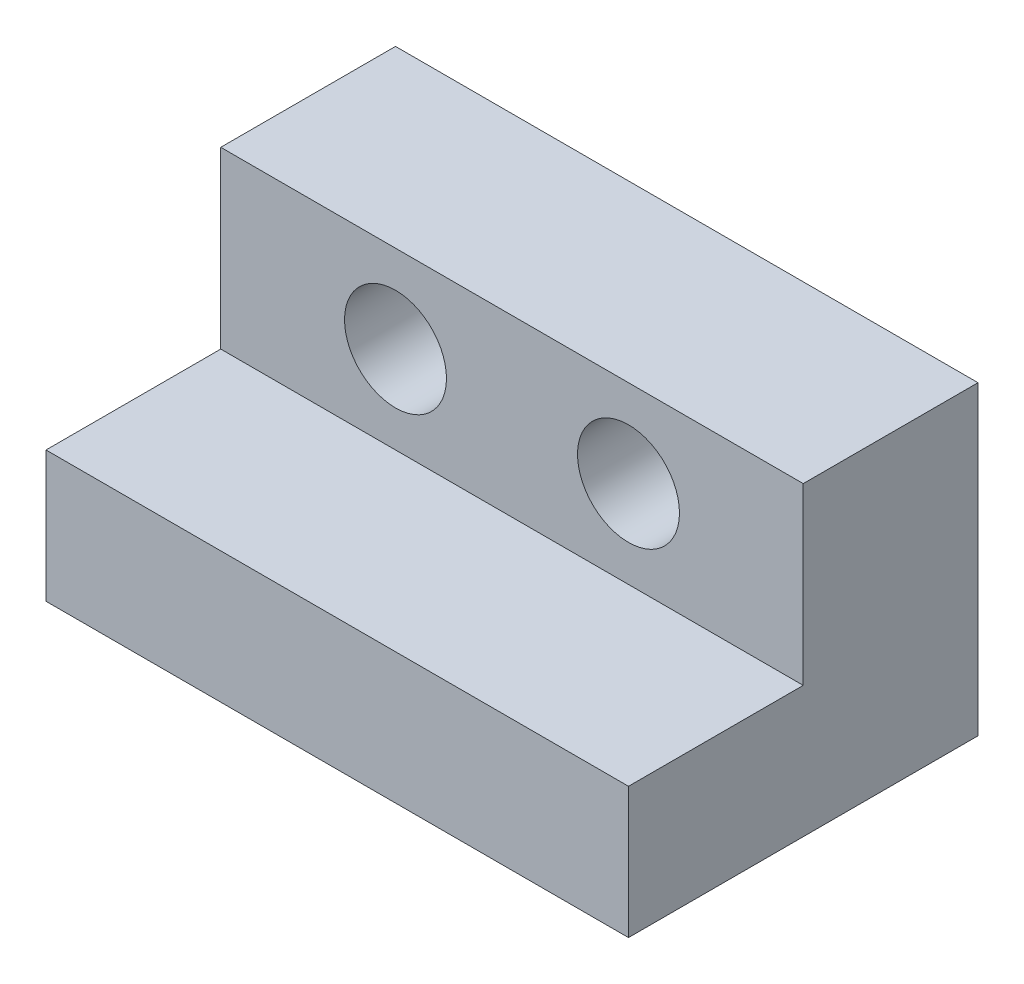
ISO-10303-21;
HEADER;
FILE_DESCRIPTION(('STEP AP214'),'2;1');
FILE_NAME('part.step','',(''),(''),'','','');
FILE_SCHEMA(('AUTOMOTIVE_DESIGN { 1 0 10303 214 1 1 1 1 }'));
ENDSEC;
DATA;
#1=APPLICATION_CONTEXT('core data for automotive mechanical design processes');
#2=APPLICATION_PROTOCOL_DEFINITION('international standard','automotive_design',2000,#1);
#3=PRODUCT_CONTEXT('',#1,'mechanical');
#4=PRODUCT('Part','Part','',(#3));
#5=PRODUCT_RELATED_PRODUCT_CATEGORY('part','',(#4));
#6=PRODUCT_DEFINITION_FORMATION('','',#4);
#7=PRODUCT_DEFINITION_CONTEXT('part definition',#1,'design');
#8=PRODUCT_DEFINITION('design','',#6,#7);
#9=PRODUCT_DEFINITION_SHAPE('','',#8);
#10=(LENGTH_UNIT() NAMED_UNIT(*) SI_UNIT(.MILLI.,.METRE.));
#11=(NAMED_UNIT(*) PLANE_ANGLE_UNIT() SI_UNIT($,.RADIAN.));
#12=(NAMED_UNIT(*) SI_UNIT($,.STERADIAN.) SOLID_ANGLE_UNIT());
#13=UNCERTAINTY_MEASURE_WITH_UNIT(LENGTH_MEASURE(1.E-05),#10,'distance_accuracy_value','');
#14=(GEOMETRIC_REPRESENTATION_CONTEXT(3) GLOBAL_UNCERTAINTY_ASSIGNED_CONTEXT((#13)) GLOBAL_UNIT_ASSIGNED_CONTEXT((#10,
#11,#12)) REPRESENTATION_CONTEXT('',''));
#15=CARTESIAN_POINT('',(0.,0.,0.));
#16=DIRECTION('',(0.,0.,1.));
#17=DIRECTION('',(1.,0.,0.));
#18=AXIS2_PLACEMENT_3D('',#15,#16,#17);
#19=CARTESIAN_POINT('',(-10.,15.5,12.));
#20=DIRECTION('',(0.,-1.,0.));
#21=DIRECTION('',(0.,0.,-1.));
#22=AXIS2_PLACEMENT_3D('',#19,#20,#21);
#23=PLANE('',#22);
#24=DIRECTION('',(-1.,0.,0.));
#25=VECTOR('',#24,1.);
#26=CARTESIAN_POINT('',(0.,15.5,6.));
#27=LINE('',#26,#25);
#28=CARTESIAN_POINT('',(10.,15.5,6.));
#29=VERTEX_POINT('',#28);
#30=CARTESIAN_POINT('',(-10.,15.5,6.));
#31=VERTEX_POINT('',#30);
#32=EDGE_CURVE('E54',#29,#31,#27,.T.);
#33=ORIENTED_EDGE('',*,*,#32,.F.);
#34=DIRECTION('',(0.,0.,-1.));
#35=VECTOR('',#34,1.);
#36=CARTESIAN_POINT('',(10.,15.5,12.));
#37=LINE('',#36,#35);
#38=CARTESIAN_POINT('',(10.,15.5,0.));
#39=VERTEX_POINT('',#38);
#40=EDGE_CURVE('E11',#29,#39,#37,.T.);
#41=ORIENTED_EDGE('',*,*,#40,.T.);
#42=DIRECTION('',(-1.,0.,0.));
#43=VECTOR('',#42,1.);
#44=CARTESIAN_POINT('',(-10.,15.5,0.));
#45=LINE('',#44,#43);
#46=CARTESIAN_POINT('',(-10.,15.5,0.));
#47=VERTEX_POINT('',#46);
#48=EDGE_CURVE('E105',#39,#47,#45,.T.);
#49=ORIENTED_EDGE('',*,*,#48,.T.);
#50=DIRECTION('',(0.,0.,-1.));
#51=VECTOR('',#50,1.);
#52=CARTESIAN_POINT('',(-10.,15.5,12.));
#53=LINE('',#52,#51);
#54=EDGE_CURVE('E47',#31,#47,#53,.T.);
#55=ORIENTED_EDGE('',*,*,#54,.F.);
#56=EDGE_LOOP('',(#33,#41,#49,#55));
#57=FACE_BOUND('',#56,.T.);
#58=ADVANCED_FACE('F39',(#57),#23,.F.);
#59=CARTESIAN_POINT('',(4.,12.5,12.));
#60=DIRECTION('',(0.,0.,-1.));
#61=DIRECTION('',(-1.,0.,0.));
#62=AXIS2_PLACEMENT_3D('',#59,#60,#61);
#63=CYLINDRICAL_SURFACE('',#62,1.75);
#64=CARTESIAN_POINT('',(4.,12.5,0.));
#65=DIRECTION('',(0.,0.,1.));
#66=DIRECTION('',(1.,0.,0.));
#67=AXIS2_PLACEMENT_3D('',#64,#65,#66);
#68=CIRCLE('',#67,1.75);
#69=CARTESIAN_POINT('',(5.75,12.5,0.));
#70=VERTEX_POINT('',#69);
#71=EDGE_CURVE('E106',#70,#70,#68,.T.);
#72=ORIENTED_EDGE('',*,*,#71,.F.);
#73=EDGE_LOOP('',(#72));
#74=FACE_BOUND('',#73,.T.);
#75=CARTESIAN_POINT('',(4.,12.5,6.));
#76=DIRECTION('',(0.,0.,1.));
#77=DIRECTION('',(1.,0.,0.));
#78=AXIS2_PLACEMENT_3D('',#75,#76,#77);
#79=CIRCLE('',#78,1.75);
#80=CARTESIAN_POINT('',(5.75,12.5,6.));
#81=VERTEX_POINT('',#80);
#82=EDGE_CURVE('E157',#81,#81,#79,.F.);
#83=ORIENTED_EDGE('',*,*,#82,.F.);
#84=EDGE_LOOP('',(#83));
#85=FACE_BOUND('',#84,.T.);
#86=ADVANCED_FACE('F183',(#74,#85),#63,.F.);
#87=CARTESIAN_POINT('',(-4.,12.5,12.));
#88=DIRECTION('',(0.,0.,-1.));
#89=DIRECTION('',(-1.,0.,0.));
#90=AXIS2_PLACEMENT_3D('',#87,#88,#89);
#91=CYLINDRICAL_SURFACE('',#90,1.75);
#92=CARTESIAN_POINT('',(-4.,12.5,0.));
#93=DIRECTION('',(0.,0.,1.));
#94=DIRECTION('',(-1.,0.,0.));
#95=AXIS2_PLACEMENT_3D('',#92,#93,#94);
#96=CIRCLE('',#95,1.75);
#97=CARTESIAN_POINT('',(-5.75,12.5,0.));
#98=VERTEX_POINT('',#97);
#99=EDGE_CURVE('E110',#98,#98,#96,.T.);
#100=ORIENTED_EDGE('',*,*,#99,.F.);
#101=EDGE_LOOP('',(#100));
#102=FACE_BOUND('',#101,.T.);
#103=CARTESIAN_POINT('',(-4.,12.5,6.));
#104=DIRECTION('',(0.,0.,1.));
#105=DIRECTION('',(1.,0.,0.));
#106=AXIS2_PLACEMENT_3D('',#103,#104,#105);
#107=CIRCLE('',#106,1.75);
#108=CARTESIAN_POINT('',(-2.25,12.5,6.));
#109=VERTEX_POINT('',#108);
#110=EDGE_CURVE('E146',#109,#109,#107,.F.);
#111=ORIENTED_EDGE('',*,*,#110,.F.);
#112=EDGE_LOOP('',(#111));
#113=FACE_BOUND('',#112,.T.);
#114=ADVANCED_FACE('F187',(#102,#113),#91,.F.);
#115=CARTESIAN_POINT('',(0.,0.,12.));
#116=DIRECTION('',(0.,0.,-1.));
#117=DIRECTION('',(-1.,0.,0.));
#118=AXIS2_PLACEMENT_3D('',#115,#116,#117);
#119=PLANE('',#118);
#120=DIRECTION('',(0.,1.,0.));
#121=VECTOR('',#120,1.);
#122=CARTESIAN_POINT('',(10.,5.,12.));
#123=LINE('',#122,#121);
#124=CARTESIAN_POINT('',(10.,5.,12.));
#125=VERTEX_POINT('',#124);
#126=CARTESIAN_POINT('',(10.,9.5,12.));
#127=VERTEX_POINT('',#126);
#128=EDGE_CURVE('E91',#125,#127,#123,.T.);
#129=ORIENTED_EDGE('',*,*,#128,.T.);
#130=DIRECTION('',(1.,0.,0.));
#131=VECTOR('',#130,1.);
#132=CARTESIAN_POINT('',(0.,9.5,12.));
#133=LINE('',#132,#131);
#134=CARTESIAN_POINT('',(-10.,9.5,12.));
#135=VERTEX_POINT('',#134);
#136=EDGE_CURVE('E138',#135,#127,#133,.T.);
#137=ORIENTED_EDGE('',*,*,#136,.F.);
#138=DIRECTION('',(0.,-1.,0.));
#139=VECTOR('',#138,1.);
#140=CARTESIAN_POINT('',(-10.,5.,12.));
#141=LINE('',#140,#139);
#142=CARTESIAN_POINT('',(-10.,5.,12.));
#143=VERTEX_POINT('',#142);
#144=EDGE_CURVE('E148',#135,#143,#141,.T.);
#145=ORIENTED_EDGE('',*,*,#144,.T.);
#146=DIRECTION('',(1.,0.,0.));
#147=VECTOR('',#146,1.);
#148=CARTESIAN_POINT('',(-10.,5.,12.));
#149=LINE('',#148,#147);
#150=EDGE_CURVE('E63',#143,#125,#149,.T.);
#151=ORIENTED_EDGE('',*,*,#150,.T.);
#152=EDGE_LOOP('',(#129,#137,#145,#151));
#153=FACE_BOUND('',#152,.T.);
#154=ADVANCED_FACE('F156',(#153),#119,.F.);
#155=CARTESIAN_POINT('',(0.,0.,0.));
#156=DIRECTION('',(0.,0.,-1.));
#157=DIRECTION('',(-1.,0.,0.));
#158=AXIS2_PLACEMENT_3D('',#155,#156,#157);
#159=PLANE('',#158);
#160=ORIENTED_EDGE('',*,*,#71,.T.);
#161=EDGE_LOOP('',(#160));
#162=FACE_BOUND('',#161,.T.);
#163=DIRECTION('',(0.,1.,0.));
#164=VECTOR('',#163,1.);
#165=CARTESIAN_POINT('',(10.,5.,0.));
#166=LINE('',#165,#164);
#167=CARTESIAN_POINT('',(10.,5.,0.));
#168=VERTEX_POINT('',#167);
#169=EDGE_CURVE('E98',#168,#39,#166,.T.);
#170=ORIENTED_EDGE('',*,*,#169,.F.);
#171=DIRECTION('',(1.,0.,0.));
#172=VECTOR('',#171,1.);
#173=CARTESIAN_POINT('',(-10.,5.,0.));
#174=LINE('',#173,#172);
#175=CARTESIAN_POINT('',(-10.,5.,0.));
#176=VERTEX_POINT('',#175);
#177=EDGE_CURVE('E81',#176,#168,#174,.T.);
#178=ORIENTED_EDGE('',*,*,#177,.F.);
#179=DIRECTION('',(0.,-1.,0.));
#180=VECTOR('',#179,1.);
#181=CARTESIAN_POINT('',(-10.,5.,0.));
#182=LINE('',#181,#180);
#183=EDGE_CURVE('E92',#47,#176,#182,.T.);
#184=ORIENTED_EDGE('',*,*,#183,.F.);
#185=ORIENTED_EDGE('',*,*,#48,.F.);
#186=EDGE_LOOP('',(#170,#178,#184,#185));
#187=FACE_BOUND('',#186,.T.);
#188=ORIENTED_EDGE('',*,*,#99,.T.);
#189=EDGE_LOOP('',(#188));
#190=FACE_BOUND('',#189,.T.);
#191=ADVANCED_FACE('F102',(#162,#187,#190),#159,.T.);
#192=CARTESIAN_POINT('',(10.,5.,12.));
#193=DIRECTION('',(-1.,0.,0.));
#194=DIRECTION('',(0.,0.,1.));
#195=AXIS2_PLACEMENT_3D('',#192,#193,#194);
#196=PLANE('',#195);
#197=DIRECTION('',(0.,1.,0.));
#198=VECTOR('',#197,1.);
#199=CARTESIAN_POINT('',(10.,0.,6.));
#200=LINE('',#199,#198);
#201=CARTESIAN_POINT('',(10.,9.5,6.));
#202=VERTEX_POINT('',#201);
#203=EDGE_CURVE('E124',#202,#29,#200,.T.);
#204=ORIENTED_EDGE('',*,*,#203,.F.);
#205=DIRECTION('',(0.,0.,1.));
#206=VECTOR('',#205,1.);
#207=CARTESIAN_POINT('',(10.,9.5,6.));
#208=LINE('',#207,#206);
#209=EDGE_CURVE('E143',#202,#127,#208,.T.);
#210=ORIENTED_EDGE('',*,*,#209,.T.);
#211=ORIENTED_EDGE('',*,*,#128,.F.);
#212=DIRECTION('',(0.,0.,-1.));
#213=VECTOR('',#212,1.);
#214=CARTESIAN_POINT('',(10.,5.,12.));
#215=LINE('',#214,#213);
#216=EDGE_CURVE('E84',#125,#168,#215,.T.);
#217=ORIENTED_EDGE('',*,*,#216,.T.);
#218=ORIENTED_EDGE('',*,*,#169,.T.);
#219=ORIENTED_EDGE('',*,*,#40,.F.);
#220=EDGE_LOOP('',(#204,#210,#211,#217,#218,#219));
#221=FACE_BOUND('',#220,.T.);
#222=ADVANCED_FACE('F41',(#221),#196,.F.);
#223=CARTESIAN_POINT('',(-10.,5.,12.));
#224=DIRECTION('',(1.,0.,0.));
#225=DIRECTION('',(0.,0.,-1.));
#226=AXIS2_PLACEMENT_3D('',#223,#224,#225);
#227=PLANE('',#226);
#228=ORIENTED_EDGE('',*,*,#144,.F.);
#229=DIRECTION('',(0.,0.,1.));
#230=VECTOR('',#229,1.);
#231=CARTESIAN_POINT('',(-10.,9.5,6.));
#232=LINE('',#231,#230);
#233=CARTESIAN_POINT('',(-10.,9.5,6.));
#234=VERTEX_POINT('',#233);
#235=EDGE_CURVE('E142',#234,#135,#232,.T.);
#236=ORIENTED_EDGE('',*,*,#235,.F.);
#237=DIRECTION('',(0.,-1.,0.));
#238=VECTOR('',#237,1.);
#239=CARTESIAN_POINT('',(-10.,0.,6.));
#240=LINE('',#239,#238);
#241=EDGE_CURVE('E121',#31,#234,#240,.T.);
#242=ORIENTED_EDGE('',*,*,#241,.F.);
#243=ORIENTED_EDGE('',*,*,#54,.T.);
#244=ORIENTED_EDGE('',*,*,#183,.T.);
#245=DIRECTION('',(0.,0.,-1.));
#246=VECTOR('',#245,1.);
#247=CARTESIAN_POINT('',(-10.,5.,12.));
#248=LINE('',#247,#246);
#249=EDGE_CURVE('E87',#143,#176,#248,.T.);
#250=ORIENTED_EDGE('',*,*,#249,.F.);
#251=EDGE_LOOP('',(#228,#236,#242,#243,#244,#250));
#252=FACE_BOUND('',#251,.T.);
#253=ADVANCED_FACE('F119',(#252),#227,.F.);
#254=CARTESIAN_POINT('',(-10.,5.,12.));
#255=DIRECTION('',(0.,1.,0.));
#256=DIRECTION('',(0.,0.,1.));
#257=AXIS2_PLACEMENT_3D('',#254,#255,#256);
#258=PLANE('',#257);
#259=CARTESIAN_POINT('',(0.,5.,5.));
#260=DIRECTION('',(0.,-1.,0.));
#261=DIRECTION('',(0.,0.,-1.));
#262=AXIS2_PLACEMENT_3D('',#259,#260,#261);
#263=CIRCLE('',#262,4.25);
#264=CARTESIAN_POINT('',(0.,5.,0.75));
#265=VERTEX_POINT('',#264);
#266=EDGE_CURVE('E162',#265,#265,#263,.T.);
#267=ORIENTED_EDGE('',*,*,#266,.F.);
#268=EDGE_LOOP('',(#267));
#269=FACE_BOUND('',#268,.T.);
#270=ORIENTED_EDGE('',*,*,#177,.T.);
#271=ORIENTED_EDGE('',*,*,#216,.F.);
#272=ORIENTED_EDGE('',*,*,#150,.F.);
#273=ORIENTED_EDGE('',*,*,#249,.T.);
#274=EDGE_LOOP('',(#270,#271,#272,#273));
#275=FACE_BOUND('',#274,.T.);
#276=ADVANCED_FACE('F83',(#269,#275),#258,.F.);
#277=CARTESIAN_POINT('',(0.,9.5,6.));
#278=DIRECTION('',(0.,-1.,0.));
#279=DIRECTION('',(0.,0.,-1.));
#280=AXIS2_PLACEMENT_3D('',#277,#278,#279);
#281=PLANE('',#280);
#282=ORIENTED_EDGE('',*,*,#136,.T.);
#283=ORIENTED_EDGE('',*,*,#209,.F.);
#284=DIRECTION('',(1.,0.,0.));
#285=VECTOR('',#284,1.);
#286=CARTESIAN_POINT('',(0.,9.5,6.));
#287=LINE('',#286,#285);
#288=EDGE_CURVE('E140',#234,#202,#287,.T.);
#289=ORIENTED_EDGE('',*,*,#288,.F.);
#290=ORIENTED_EDGE('',*,*,#235,.T.);
#291=EDGE_LOOP('',(#282,#283,#289,#290));
#292=FACE_BOUND('',#291,.T.);
#293=ADVANCED_FACE('F141',(#292),#281,.F.);
#294=CARTESIAN_POINT('',(0.,0.,6.));
#295=DIRECTION('',(0.,0.,1.));
#296=DIRECTION('',(1.,0.,0.));
#297=AXIS2_PLACEMENT_3D('',#294,#295,#296);
#298=PLANE('',#297);
#299=ORIENTED_EDGE('',*,*,#82,.T.);
#300=EDGE_LOOP('',(#299));
#301=FACE_BOUND('',#300,.T.);
#302=ORIENTED_EDGE('',*,*,#110,.T.);
#303=EDGE_LOOP('',(#302));
#304=FACE_BOUND('',#303,.T.);
#305=ORIENTED_EDGE('',*,*,#241,.T.);
#306=ORIENTED_EDGE('',*,*,#288,.T.);
#307=ORIENTED_EDGE('',*,*,#203,.T.);
#308=ORIENTED_EDGE('',*,*,#32,.T.);
#309=EDGE_LOOP('',(#305,#306,#307,#308));
#310=FACE_BOUND('',#309,.T.);
#311=ADVANCED_FACE('F145',(#301,#304,#310),#298,.T.);
#312=CARTESIAN_POINT('',(0.,8.,5.));
#313=DIRECTION('',(0.,-1.,0.));
#314=DIRECTION('',(0.,0.,-1.));
#315=AXIS2_PLACEMENT_3D('',#312,#313,#314);
#316=CYLINDRICAL_SURFACE('',#315,4.25);
#317=CARTESIAN_POINT('',(0.,8.,5.));
#318=DIRECTION('',(0.,-1.,0.));
#319=DIRECTION('',(0.,0.,-1.));
#320=AXIS2_PLACEMENT_3D('',#317,#318,#319);
#321=CIRCLE('',#320,4.25);
#322=CARTESIAN_POINT('',(0.,8.,0.75));
#323=VERTEX_POINT('',#322);
#324=EDGE_CURVE('E158',#323,#323,#321,.T.);
#325=ORIENTED_EDGE('',*,*,#324,.F.);
#326=EDGE_LOOP('',(#325));
#327=FACE_BOUND('',#326,.T.);
#328=ORIENTED_EDGE('',*,*,#266,.T.);
#329=EDGE_LOOP('',(#328));
#330=FACE_BOUND('',#329,.T.);
#331=ADVANCED_FACE('F171',(#327,#330),#316,.F.);
#332=CARTESIAN_POINT('',(0.,8.,5.));
#333=DIRECTION('',(0.,-1.,0.));
#334=DIRECTION('',(0.,0.,-1.));
#335=AXIS2_PLACEMENT_3D('',#332,#333,#334);
#336=PLANE('',#335);
#337=ORIENTED_EDGE('',*,*,#324,.T.);
#338=EDGE_LOOP('',(#337));
#339=FACE_BOUND('',#338,.T.);
#340=ADVANCED_FACE('F238',(#339),#336,.T.);
#341=CLOSED_SHELL('',(#58,#86,#114,#154,#191,#222,#253,#276,#293,#311,#331,#340));
#342=MANIFOLD_SOLID_BREP('B2',#341);
#343=ADVANCED_BREP_SHAPE_REPRESENTATION('',(#18,#342),#14);
#344=SHAPE_DEFINITION_REPRESENTATION(#9,#343);
ENDSEC;
END-ISO-10303-21;
